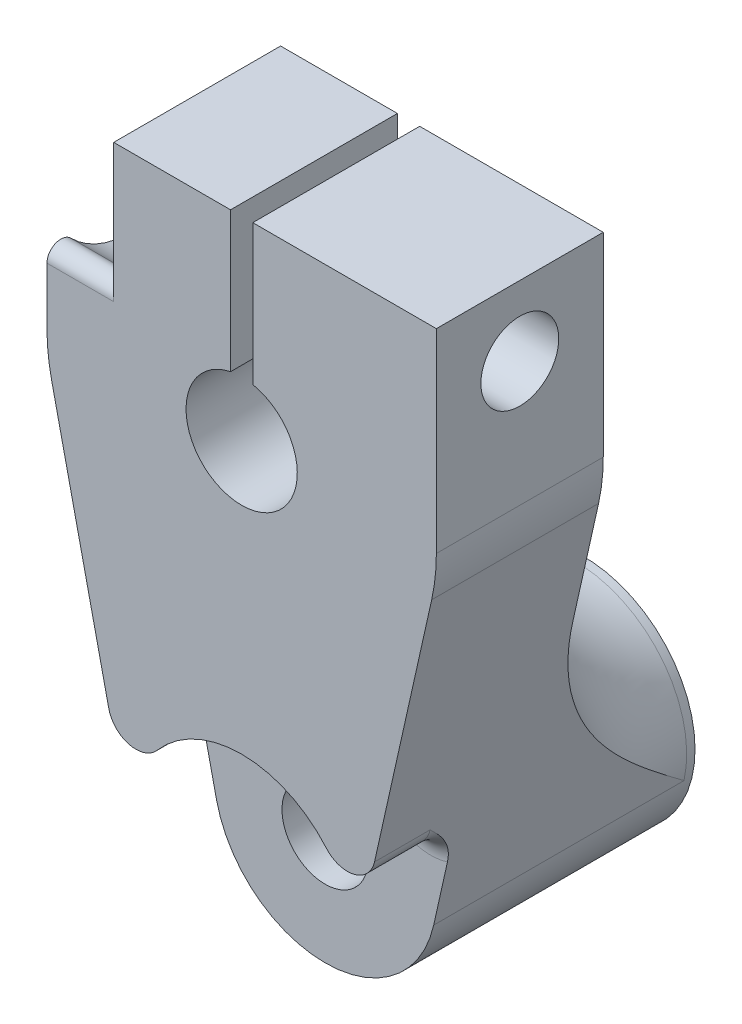
ISO-10303-21;
HEADER;
FILE_DESCRIPTION(('STEP AP214'),'2;1');
FILE_NAME('part.step','',(''),(''),'','','');
FILE_SCHEMA(('AUTOMOTIVE_DESIGN { 1 0 10303 214 1 1 1 1 }'));
ENDSEC;
DATA;
#1=APPLICATION_CONTEXT('core data for automotive mechanical design processes');
#2=APPLICATION_PROTOCOL_DEFINITION('international standard','automotive_design',2000,#1);
#3=PRODUCT_CONTEXT('',#1,'mechanical');
#4=PRODUCT('Part','Part','',(#3));
#5=PRODUCT_RELATED_PRODUCT_CATEGORY('part','',(#4));
#6=PRODUCT_DEFINITION_FORMATION('','',#4);
#7=PRODUCT_DEFINITION_CONTEXT('part definition',#1,'design');
#8=PRODUCT_DEFINITION('design','',#6,#7);
#9=PRODUCT_DEFINITION_SHAPE('','',#8);
#10=(LENGTH_UNIT() NAMED_UNIT(*) SI_UNIT(.MILLI.,.METRE.));
#11=(NAMED_UNIT(*) PLANE_ANGLE_UNIT() SI_UNIT($,.RADIAN.));
#12=(NAMED_UNIT(*) SI_UNIT($,.STERADIAN.) SOLID_ANGLE_UNIT());
#13=UNCERTAINTY_MEASURE_WITH_UNIT(LENGTH_MEASURE(1.E-05),#10,'distance_accuracy_value','');
#14=(GEOMETRIC_REPRESENTATION_CONTEXT(3) GLOBAL_UNCERTAINTY_ASSIGNED_CONTEXT((#13)) GLOBAL_UNIT_ASSIGNED_CONTEXT((#10,
#11,#12)) REPRESENTATION_CONTEXT('',''));
#15=CARTESIAN_POINT('',(0.,0.,0.));
#16=DIRECTION('',(0.,0.,1.));
#17=DIRECTION('',(1.,0.,0.));
#18=AXIS2_PLACEMENT_3D('',#15,#16,#17);
#19=CARTESIAN_POINT('',(0.,0.,6.3));
#20=DIRECTION('',(0.,0.,-1.));
#21=DIRECTION('',(-1.,0.,0.));
#22=AXIS2_PLACEMENT_3D('',#19,#20,#21);
#23=CYLINDRICAL_SURFACE('',#22,4.);
#24=CARTESIAN_POINT('',(0.,0.,0.));
#25=DIRECTION('',(0.,0.,1.));
#26=DIRECTION('',(1.,0.,0.));
#27=AXIS2_PLACEMENT_3D('',#24,#25,#26);
#28=CIRCLE('',#27,4.);
#29=CARTESIAN_POINT('',(4.,0.,0.));
#30=VERTEX_POINT('',#29);
#31=EDGE_CURVE('E270',#30,#30,#28,.T.);
#32=ORIENTED_EDGE('',*,*,#31,.T.);
#33=EDGE_LOOP('',(#32));
#34=FACE_BOUND('',#33,.T.);
#35=CARTESIAN_POINT('',(0.,0.,9.3));
#36=DIRECTION('',(0.,0.,1.));
#37=DIRECTION('',(1.,0.,0.));
#38=AXIS2_PLACEMENT_3D('',#35,#36,#37);
#39=CIRCLE('',#38,4.);
#40=CARTESIAN_POINT('',(-3.90359990726215,-0.872873280621486,9.3));
#41=VERTEX_POINT('',#40);
#42=CARTESIAN_POINT('',(3.90359990726215,-0.872873280621487,9.3));
#43=VERTEX_POINT('',#42);
#44=EDGE_CURVE('E536',#41,#43,#39,.T.);
#45=ORIENTED_EDGE('',*,*,#44,.F.);
#46=DIRECTION('',(0.,0.,-1.));
#47=VECTOR('',#46,1.);
#48=CARTESIAN_POINT('',(-3.90359990726215,-0.872873280621486,12.3));
#49=LINE('',#48,#47);
#50=CARTESIAN_POINT('',(-3.90359990726215,-0.872873280621486,0.3));
#51=VERTEX_POINT('',#50);
#52=EDGE_CURVE('E260',#41,#51,#49,.T.);
#53=ORIENTED_EDGE('',*,*,#52,.T.);
#54=CARTESIAN_POINT('',(0.,0.,0.3));
#55=DIRECTION('',(0.,0.,1.));
#56=DIRECTION('',(1.,0.,0.));
#57=AXIS2_PLACEMENT_3D('',#54,#55,#56);
#58=CIRCLE('',#57,4.);
#59=CARTESIAN_POINT('',(3.90359990726215,-0.872873280621487,0.3));
#60=VERTEX_POINT('',#59);
#61=EDGE_CURVE('E297',#51,#60,#58,.F.);
#62=ORIENTED_EDGE('',*,*,#61,.T.);
#63=DIRECTION('',(0.,0.,-1.));
#64=VECTOR('',#63,1.);
#65=CARTESIAN_POINT('',(3.90359990726215,-0.872873280621487,12.3));
#66=LINE('',#65,#64);
#67=EDGE_CURVE('E258',#43,#60,#66,.T.);
#68=ORIENTED_EDGE('',*,*,#67,.F.);
#69=EDGE_LOOP('',(#45,#53,#62,#68));
#70=FACE_BOUND('',#69,.T.);
#71=ADVANCED_FACE('F53',(#34,#70),#23,.T.);
#72=CARTESIAN_POINT('',(0.,0.,6.3));
#73=DIRECTION('',(0.,0.,-1.));
#74=DIRECTION('',(-1.,0.,0.));
#75=AXIS2_PLACEMENT_3D('',#72,#73,#74);
#76=CYLINDRICAL_SURFACE('',#75,1.55);
#77=CARTESIAN_POINT('',(0.,0.,0.));
#78=DIRECTION('',(0.,0.,1.));
#79=DIRECTION('',(1.,0.,0.));
#80=AXIS2_PLACEMENT_3D('',#77,#78,#79);
#81=CIRCLE('',#80,1.55);
#82=CARTESIAN_POINT('',(1.55,0.,0.));
#83=VERTEX_POINT('',#82);
#84=EDGE_CURVE('E267',#83,#83,#81,.T.);
#85=ORIENTED_EDGE('',*,*,#84,.F.);
#86=EDGE_LOOP('',(#85));
#87=FACE_BOUND('',#86,.T.);
#88=CARTESIAN_POINT('',(0.,0.,9.3));
#89=DIRECTION('',(0.,0.,1.));
#90=DIRECTION('',(1.,0.,0.));
#91=AXIS2_PLACEMENT_3D('',#88,#89,#90);
#92=CIRCLE('',#91,1.55);
#93=CARTESIAN_POINT('',(1.55,0.,9.3));
#94=VERTEX_POINT('',#93);
#95=EDGE_CURVE('E539',#94,#94,#92,.T.);
#96=ORIENTED_EDGE('',*,*,#95,.T.);
#97=EDGE_LOOP('',(#96));
#98=FACE_BOUND('',#97,.T.);
#99=ADVANCED_FACE('F415',(#87,#98),#76,.F.);
#100=CARTESIAN_POINT('',(0.,20.7477,12.3));
#101=DIRECTION('',(0.,1.,0.));
#102=DIRECTION('',(0.,0.,1.));
#103=AXIS2_PLACEMENT_3D('',#100,#101,#102);
#104=PLANE('',#103);
#105=DIRECTION('',(1.,0.,0.));
#106=VECTOR('',#105,1.);
#107=CARTESIAN_POINT('',(0.,20.7477,6.3));
#108=LINE('',#107,#106);
#109=CARTESIAN_POINT('',(-4.6,20.7477,6.3));
#110=VERTEX_POINT('',#109);
#111=CARTESIAN_POINT('',(-0.4,20.7477,6.3));
#112=VERTEX_POINT('',#111);
#113=EDGE_CURVE('E228',#110,#112,#108,.T.);
#114=ORIENTED_EDGE('',*,*,#113,.F.);
#115=DIRECTION('',(0.,0.,1.));
#116=VECTOR('',#115,1.);
#117=CARTESIAN_POINT('',(-4.6,20.7477,12.3));
#118=LINE('',#117,#116);
#119=CARTESIAN_POINT('',(-4.6,20.7477,12.3));
#120=VERTEX_POINT('',#119);
#121=EDGE_CURVE('E210',#110,#120,#118,.T.);
#122=ORIENTED_EDGE('',*,*,#121,.T.);
#123=DIRECTION('',(1.,0.,0.));
#124=VECTOR('',#123,1.);
#125=CARTESIAN_POINT('',(0.,20.7477,12.3));
#126=LINE('',#125,#124);
#127=CARTESIAN_POINT('',(-0.399999999999999,20.7477,12.3));
#128=VERTEX_POINT('',#127);
#129=EDGE_CURVE('E254',#120,#128,#126,.T.);
#130=ORIENTED_EDGE('',*,*,#129,.T.);
#131=DIRECTION('',(0.,0.,1.));
#132=VECTOR('',#131,1.);
#133=CARTESIAN_POINT('',(-0.4,20.7477,12.3));
#134=LINE('',#133,#132);
#135=EDGE_CURVE('E239',#112,#128,#134,.T.);
#136=ORIENTED_EDGE('',*,*,#135,.F.);
#137=EDGE_LOOP('',(#114,#122,#130,#136));
#138=FACE_BOUND('',#137,.T.);
#139=ADVANCED_FACE('F237',(#138),#104,.T.);
#140=CARTESIAN_POINT('',(0.,0.,6.3));
#141=DIRECTION('',(0.,0.,1.));
#142=DIRECTION('',(1.,0.,0.));
#143=AXIS2_PLACEMENT_3D('',#140,#141,#142);
#144=PLANE('',#143);
#145=DIRECTION('',(-0.218218320155372,-0.975899976815538,0.));
#146=VECTOR('',#145,1.);
#147=CARTESIAN_POINT('',(3.90359990726215,-0.872873280621486,6.3));
#148=LINE('',#147,#146);
#149=CARTESIAN_POINT('',(6.83129983770877,12.2201717589124,6.3));
#150=VERTEX_POINT('',#149);
#151=CARTESIAN_POINT('',(5.90360384753835,8.07139774830422,6.3));
#152=VERTEX_POINT('',#151);
#153=EDGE_CURVE('E487',#150,#152,#148,.T.);
#154=ORIENTED_EDGE('',*,*,#153,.T.);
#155=CARTESIAN_POINT('',(0.,0.,6.3));
#156=DIRECTION('',(0.,0.,1.));
#157=DIRECTION('',(1.,0.,0.));
#158=AXIS2_PLACEMENT_3D('',#155,#156,#157);
#159=CIRCLE('',#158,10.);
#160=CARTESIAN_POINT('',(-5.90360384753835,8.07139774830422,6.3));
#161=VERTEX_POINT('',#160);
#162=EDGE_CURVE('E294',#152,#161,#159,.T.);
#163=ORIENTED_EDGE('',*,*,#162,.T.);
#164=DIRECTION('',(0.218218320155372,-0.975899976815538,0.));
#165=VECTOR('',#164,1.);
#166=CARTESIAN_POINT('',(-3.90359990726215,-0.872873280621486,6.3));
#167=LINE('',#166,#165);
#168=CARTESIAN_POINT('',(-6.83129983770877,12.2201717589124,6.3));
#169=VERTEX_POINT('',#168);
#170=EDGE_CURVE('E484',#169,#161,#167,.T.);
#171=ORIENTED_EDGE('',*,*,#170,.F.);
#172=CARTESIAN_POINT('',(0.,13.7477,6.3));
#173=DIRECTION('',(0.,0.,1.));
#174=DIRECTION('',(1.,0.,0.));
#175=AXIS2_PLACEMENT_3D('',#172,#173,#174);
#176=CIRCLE('',#175,7.);
#177=CARTESIAN_POINT('',(-7.,13.7477,6.3));
#178=VERTEX_POINT('',#177);
#179=EDGE_CURVE('E481',#178,#169,#176,.T.);
#180=ORIENTED_EDGE('',*,*,#179,.F.);
#181=DIRECTION('',(0.,1.,0.));
#182=VECTOR('',#181,1.);
#183=CARTESIAN_POINT('',(-7.,0.,6.3));
#184=LINE('',#183,#182);
#185=CARTESIAN_POINT('',(-7.,15.7867723410793,6.3));
#186=VERTEX_POINT('',#185);
#187=EDGE_CURVE('E479',#178,#186,#184,.T.);
#188=ORIENTED_EDGE('',*,*,#187,.T.);
#189=DIRECTION('',(-1.,0.,0.));
#190=VECTOR('',#189,1.);
#191=CARTESIAN_POINT('',(-4.6,15.7867723410793,6.3));
#192=LINE('',#191,#190);
#193=CARTESIAN_POINT('',(-4.6,15.7867723410793,6.3));
#194=VERTEX_POINT('',#193);
#195=EDGE_CURVE('E232',#186,#194,#192,.F.);
#196=ORIENTED_EDGE('',*,*,#195,.T.);
#197=DIRECTION('',(0.,1.,0.));
#198=VECTOR('',#197,1.);
#199=CARTESIAN_POINT('',(-4.6,0.,6.3));
#200=LINE('',#199,#198);
#201=EDGE_CURVE('E213',#194,#110,#200,.T.);
#202=ORIENTED_EDGE('',*,*,#201,.T.);
#203=ORIENTED_EDGE('',*,*,#113,.T.);
#204=DIRECTION('',(0.,-1.,0.));
#205=VECTOR('',#204,1.);
#206=CARTESIAN_POINT('',(-0.399999999999997,0.,6.3));
#207=LINE('',#206,#205);
#208=CARTESIAN_POINT('',(-0.399999999999999,15.7072917942265,6.3));
#209=VERTEX_POINT('',#208);
#210=EDGE_CURVE('E456',#112,#209,#207,.T.);
#211=ORIENTED_EDGE('',*,*,#210,.T.);
#212=CARTESIAN_POINT('',(0.,13.7477,6.3));
#213=DIRECTION('',(0.,0.,1.));
#214=DIRECTION('',(1.,0.,0.));
#215=AXIS2_PLACEMENT_3D('',#212,#213,#214);
#216=CIRCLE('',#215,2.);
#217=CARTESIAN_POINT('',(0.400000000000001,15.7072917942265,6.3));
#218=VERTEX_POINT('',#217);
#219=EDGE_CURVE('E458',#209,#218,#216,.T.);
#220=ORIENTED_EDGE('',*,*,#219,.T.);
#221=DIRECTION('',(0.,1.,0.));
#222=VECTOR('',#221,1.);
#223=CARTESIAN_POINT('',(0.400000000000003,0.,6.3));
#224=LINE('',#223,#222);
#225=CARTESIAN_POINT('',(0.4,20.7477,6.3));
#226=VERTEX_POINT('',#225);
#227=EDGE_CURVE('E449',#218,#226,#224,.T.);
#228=ORIENTED_EDGE('',*,*,#227,.T.);
#229=CARTESIAN_POINT('',(7.,20.7477,6.3));
#230=VERTEX_POINT('',#229);
#231=EDGE_CURVE('E241',#226,#230,#108,.T.);
#232=ORIENTED_EDGE('',*,*,#231,.T.);
#233=DIRECTION('',(0.,-1.,0.));
#234=VECTOR('',#233,1.);
#235=CARTESIAN_POINT('',(7.,0.,6.3));
#236=LINE('',#235,#234);
#237=CARTESIAN_POINT('',(7.,13.7477,6.3));
#238=VERTEX_POINT('',#237);
#239=EDGE_CURVE('E246',#230,#238,#236,.T.);
#240=ORIENTED_EDGE('',*,*,#239,.T.);
#241=CARTESIAN_POINT('',(0.,13.7477,6.3));
#242=DIRECTION('',(0.,0.,1.));
#243=DIRECTION('',(1.,0.,0.));
#244=AXIS2_PLACEMENT_3D('',#241,#242,#243);
#245=CIRCLE('',#244,7.);
#246=EDGE_CURVE('E488',#150,#238,#245,.T.);
#247=ORIENTED_EDGE('',*,*,#246,.F.);
#248=EDGE_LOOP('',(#154,#163,#171,#180,#188,#196,#202,#203,#211,#220,#228,#232,#240,#247));
#249=FACE_BOUND('',#248,.T.);
#250=ADVANCED_FACE('F226',(#249),#144,.F.);
#251=CARTESIAN_POINT('',(-7.,0.,12.3));
#252=DIRECTION('',(-1.,0.,0.));
#253=DIRECTION('',(0.,0.,1.));
#254=AXIS2_PLACEMENT_3D('',#251,#252,#253);
#255=PLANE('',#254);
#256=DIRECTION('',(0.,1.,0.));
#257=VECTOR('',#256,1.);
#258=CARTESIAN_POINT('',(-7.,0.,12.3));
#259=LINE('',#258,#257);
#260=CARTESIAN_POINT('',(-7.,13.7477,12.3));
#261=VERTEX_POINT('',#260);
#262=CARTESIAN_POINT('',(-7.,15.7867723410793,12.3));
#263=VERTEX_POINT('',#262);
#264=EDGE_CURVE('E244',#261,#263,#259,.T.);
#265=ORIENTED_EDGE('',*,*,#264,.T.);
#266=CARTESIAN_POINT('',(-7.,15.7867723410793,11.8));
#267=DIRECTION('',(-1.,0.,0.));
#268=DIRECTION('',(0.,0.,1.));
#269=AXIS2_PLACEMENT_3D('',#266,#267,#268);
#270=CIRCLE('',#269,0.5);
#271=CARTESIAN_POINT('',(-7.,16.1366994471912,11.4428571428571));
#272=VERTEX_POINT('',#271);
#273=EDGE_CURVE('E287',#263,#272,#270,.T.);
#274=ORIENTED_EDGE('',*,*,#273,.T.);
#275=CARTESIAN_POINT('',(-7.,18.2362620838625,9.3));
#276=DIRECTION('',(-1.,0.,0.));
#277=DIRECTION('',(0.,-1.,0.));
#278=AXIS2_PLACEMENT_3D('',#275,#276,#277);
#279=CIRCLE('',#278,3.);
#280=CARTESIAN_POINT('',(-7.,16.1366994471912,7.15714285714286));
#281=VERTEX_POINT('',#280);
#282=EDGE_CURVE('E221',#281,#272,#279,.T.);
#283=ORIENTED_EDGE('',*,*,#282,.F.);
#284=CARTESIAN_POINT('',(-7.,15.7867723410793,6.8));
#285=DIRECTION('',(-1.,0.,0.));
#286=DIRECTION('',(0.,0.,1.));
#287=AXIS2_PLACEMENT_3D('',#284,#285,#286);
#288=CIRCLE('',#287,0.5);
#289=EDGE_CURVE('E285',#281,#186,#288,.T.);
#290=ORIENTED_EDGE('',*,*,#289,.T.);
#291=ORIENTED_EDGE('',*,*,#187,.F.);
#292=DIRECTION('',(0.,0.,-1.));
#293=VECTOR('',#292,1.);
#294=CARTESIAN_POINT('',(-7.,13.7477,12.3));
#295=LINE('',#294,#293);
#296=EDGE_CURVE('E265',#261,#178,#295,.T.);
#297=ORIENTED_EDGE('',*,*,#296,.F.);
#298=EDGE_LOOP('',(#265,#274,#283,#290,#291,#297));
#299=FACE_BOUND('',#298,.T.);
#300=ADVANCED_FACE('F375',(#299),#255,.T.);
#301=CARTESIAN_POINT('',(0.,0.,12.3));
#302=DIRECTION('',(0.,0.,1.));
#303=DIRECTION('',(1.,0.,0.));
#304=AXIS2_PLACEMENT_3D('',#301,#302,#303);
#305=PLANE('',#304);
#306=DIRECTION('',(0.218218320155372,-0.975899976815538,0.));
#307=VECTOR('',#306,1.);
#308=CARTESIAN_POINT('',(-3.90359990726215,-0.872873280621486,12.3));
#309=LINE('',#308,#307);
#310=CARTESIAN_POINT('',(-6.83129983770877,12.2201717589124,12.3));
#311=VERTEX_POINT('',#310);
#312=CARTESIAN_POINT('',(-4.77647318788364,3.03072662664066,12.3));
#313=VERTEX_POINT('',#312);
#314=EDGE_CURVE('E464',#311,#313,#309,.T.);
#315=ORIENTED_EDGE('',*,*,#314,.T.);
#316=CARTESIAN_POINT('',(-3.8005732110681,3.24894494679603,12.3));
#317=DIRECTION('',(0.,0.,1.));
#318=DIRECTION('',(1.,0.,0.));
#319=AXIS2_PLACEMENT_3D('',#316,#317,#318);
#320=CIRCLE('',#319,1.);
#321=CARTESIAN_POINT('',(-3.04045856885448,2.59915595743683,12.3));
#322=VERTEX_POINT('',#321);
#323=EDGE_CURVE('E516',#313,#322,#320,.T.);
#324=ORIENTED_EDGE('',*,*,#323,.T.);
#325=CARTESIAN_POINT('',(0.,0.,12.3));
#326=DIRECTION('',(0.,0.,1.));
#327=DIRECTION('',(1.,0.,0.));
#328=AXIS2_PLACEMENT_3D('',#325,#326,#327);
#329=CIRCLE('',#328,4.);
#330=CARTESIAN_POINT('',(3.04045856885448,2.59915595743683,12.3));
#331=VERTEX_POINT('',#330);
#332=EDGE_CURVE('E535',#331,#322,#329,.T.);
#333=ORIENTED_EDGE('',*,*,#332,.F.);
#334=CARTESIAN_POINT('',(3.8005732110681,3.24894494679604,12.3));
#335=DIRECTION('',(0.,0.,1.));
#336=DIRECTION('',(1.,0.,0.));
#337=AXIS2_PLACEMENT_3D('',#334,#335,#336);
#338=CIRCLE('',#337,1.);
#339=CARTESIAN_POINT('',(4.77647318788364,3.03072662664067,12.3));
#340=VERTEX_POINT('',#339);
#341=EDGE_CURVE('E503',#331,#340,#338,.T.);
#342=ORIENTED_EDGE('',*,*,#341,.T.);
#343=DIRECTION('',(-0.218218320155372,-0.975899976815538,0.));
#344=VECTOR('',#343,1.);
#345=CARTESIAN_POINT('',(3.90359990726215,-0.872873280621486,12.3));
#346=LINE('',#345,#344);
#347=CARTESIAN_POINT('',(6.83129983770877,12.2201717589124,12.3));
#348=VERTEX_POINT('',#347);
#349=EDGE_CURVE('E467',#348,#340,#346,.T.);
#350=ORIENTED_EDGE('',*,*,#349,.F.);
#351=CARTESIAN_POINT('',(0.,13.7477,12.3));
#352=DIRECTION('',(0.,0.,1.));
#353=DIRECTION('',(1.,0.,0.));
#354=AXIS2_PLACEMENT_3D('',#351,#352,#353);
#355=CIRCLE('',#354,7.);
#356=CARTESIAN_POINT('',(7.,13.7477,12.3));
#357=VERTEX_POINT('',#356);
#358=EDGE_CURVE('E470',#348,#357,#355,.T.);
#359=ORIENTED_EDGE('',*,*,#358,.T.);
#360=DIRECTION('',(0.,-1.,0.));
#361=VECTOR('',#360,1.);
#362=CARTESIAN_POINT('',(7.,0.,12.3));
#363=LINE('',#362,#361);
#364=CARTESIAN_POINT('',(7.,20.7477,12.3));
#365=VERTEX_POINT('',#364);
#366=EDGE_CURVE('E472',#365,#357,#363,.T.);
#367=ORIENTED_EDGE('',*,*,#366,.F.);
#368=CARTESIAN_POINT('',(0.4,20.7477,12.3));
#369=VERTEX_POINT('',#368);
#370=EDGE_CURVE('E475',#369,#365,#126,.T.);
#371=ORIENTED_EDGE('',*,*,#370,.F.);
#372=DIRECTION('',(0.,1.,0.));
#373=VECTOR('',#372,1.);
#374=CARTESIAN_POINT('',(0.400000000000003,0.,12.3));
#375=LINE('',#374,#373);
#376=CARTESIAN_POINT('',(0.400000000000001,15.7072917942265,12.3));
#377=VERTEX_POINT('',#376);
#378=EDGE_CURVE('E273',#377,#369,#375,.T.);
#379=ORIENTED_EDGE('',*,*,#378,.F.);
#380=CARTESIAN_POINT('',(0.,13.7477,12.3));
#381=DIRECTION('',(0.,0.,1.));
#382=DIRECTION('',(1.,0.,0.));
#383=AXIS2_PLACEMENT_3D('',#380,#381,#382);
#384=CIRCLE('',#383,2.);
#385=CARTESIAN_POINT('',(-0.399999999999999,15.7072917942265,12.3));
#386=VERTEX_POINT('',#385);
#387=EDGE_CURVE('E240',#386,#377,#384,.T.);
#388=ORIENTED_EDGE('',*,*,#387,.F.);
#389=DIRECTION('',(0.,-1.,0.));
#390=VECTOR('',#389,1.);
#391=CARTESIAN_POINT('',(-0.399999999999997,0.,12.3));
#392=LINE('',#391,#390);
#393=EDGE_CURVE('E275',#128,#386,#392,.T.);
#394=ORIENTED_EDGE('',*,*,#393,.F.);
#395=ORIENTED_EDGE('',*,*,#129,.F.);
#396=DIRECTION('',(0.,-1.,0.));
#397=VECTOR('',#396,1.);
#398=CARTESIAN_POINT('',(-4.6,0.,12.3));
#399=LINE('',#398,#397);
#400=CARTESIAN_POINT('',(-4.6,15.7867723410793,12.3));
#401=VERTEX_POINT('',#400);
#402=EDGE_CURVE('E216',#120,#401,#399,.T.);
#403=ORIENTED_EDGE('',*,*,#402,.T.);
#404=DIRECTION('',(1.,0.,0.));
#405=VECTOR('',#404,1.);
#406=CARTESIAN_POINT('',(0.,15.7867723410793,12.3));
#407=LINE('',#406,#405);
#408=EDGE_CURVE('E283',#401,#263,#407,.F.);
#409=ORIENTED_EDGE('',*,*,#408,.T.);
#410=ORIENTED_EDGE('',*,*,#264,.F.);
#411=CARTESIAN_POINT('',(0.,13.7477,12.3));
#412=DIRECTION('',(0.,0.,1.));
#413=DIRECTION('',(1.,0.,0.));
#414=AXIS2_PLACEMENT_3D('',#411,#412,#413);
#415=CIRCLE('',#414,7.);
#416=EDGE_CURVE('E461',#261,#311,#415,.T.);
#417=ORIENTED_EDGE('',*,*,#416,.T.);
#418=EDGE_LOOP('',(#315,#324,#333,#342,#350,#359,#367,#371,#379,#388,#394,#395,#403,#409,#410,#417));
#419=FACE_BOUND('',#418,.T.);
#420=ADVANCED_FACE('F376',(#419),#305,.T.);
#421=CARTESIAN_POINT('',(0.,0.,0.));
#422=DIRECTION('',(0.,0.,1.));
#423=DIRECTION('',(1.,0.,0.));
#424=AXIS2_PLACEMENT_3D('',#421,#422,#423);
#425=PLANE('',#424);
#426=ORIENTED_EDGE('',*,*,#31,.F.);
#427=EDGE_LOOP('',(#426));
#428=FACE_BOUND('',#427,.T.);
#429=ORIENTED_EDGE('',*,*,#84,.T.);
#430=EDGE_LOOP('',(#429));
#431=FACE_BOUND('',#430,.T.);
#432=ADVANCED_FACE('F379',(#428,#431),#425,.F.);
#433=CARTESIAN_POINT('',(0.,13.7477,12.3));
#434=DIRECTION('',(0.,0.,-1.));
#435=DIRECTION('',(-1.,0.,0.));
#436=AXIS2_PLACEMENT_3D('',#433,#434,#435);
#437=CYLINDRICAL_SURFACE('',#436,7.);
#438=ORIENTED_EDGE('',*,*,#179,.T.);
#439=DIRECTION('',(0.,0.,-1.));
#440=VECTOR('',#439,1.);
#441=CARTESIAN_POINT('',(-6.83129983770877,12.2201717589124,12.3));
#442=LINE('',#441,#440);
#443=EDGE_CURVE('E262',#311,#169,#442,.T.);
#444=ORIENTED_EDGE('',*,*,#443,.F.);
#445=ORIENTED_EDGE('',*,*,#416,.F.);
#446=ORIENTED_EDGE('',*,*,#296,.T.);
#447=EDGE_LOOP('',(#438,#444,#445,#446));
#448=FACE_BOUND('',#447,.T.);
#449=ADVANCED_FACE('F573',(#448),#437,.T.);
#450=CARTESIAN_POINT('',(-3.90359990726215,-0.872873280621486,12.3));
#451=DIRECTION('',(0.975899976815538,0.218218320155372,0.));
#452=DIRECTION('',(-0.218218320155372,0.975899976815538,0.));
#453=AXIS2_PLACEMENT_3D('',#450,#451,#452);
#454=PLANE('',#453);
#455=ORIENTED_EDGE('',*,*,#52,.F.);
#456=DIRECTION('',(-0.218218320155372,0.975899976815538,0.));
#457=VECTOR('',#456,1.);
#458=CARTESIAN_POINT('',(-3.90359990726215,-0.872873280621486,9.3));
#459=LINE('',#458,#457);
#460=CARTESIAN_POINT('',(-4.3985079702322,1.34041828369086,9.3));
#461=VERTEX_POINT('',#460);
#462=EDGE_CURVE('E587',#41,#461,#459,.T.);
#463=ORIENTED_EDGE('',*,*,#462,.T.);
#464=CARTESIAN_POINT('',(-4.3985079702322,1.34041828369086,9.3));
#465=CARTESIAN_POINT('',(-4.40785983175291,1.38224099332746,9.29999719638696));
#466=CARTESIAN_POINT('',(-4.41720364710504,1.42402771947868,9.30206602766505));
#467=CARTESIAN_POINT('',(-4.43579849064162,1.50718621581076,9.31007196565));
#468=CARTESIAN_POINT('',(-4.44504963831165,1.54855852034627,9.31600318556926));
#469=CARTESIAN_POINT('',(-4.47236125757803,1.67069954219029,9.33899489781268));
#470=CARTESIAN_POINT('',(-4.49021776531515,1.75055610727728,9.36126812700592));
#471=CARTESIAN_POINT('',(-4.53149220480163,1.93514063028731,9.42790134045869));
#472=CARTESIAN_POINT('',(-4.55450653430521,2.03806362782928,9.47739633549625));
#473=CARTESIAN_POINT('',(-4.59864502311344,2.23545654229199,9.592304843443));
#474=CARTESIAN_POINT('',(-4.61975789889868,2.32987599788425,9.65780578217856));
#475=CARTESIAN_POINT('',(-4.66437034433781,2.52938850645242,9.81342065488173));
#476=CARTESIAN_POINT('',(-4.68747703724142,2.63272456482212,9.90582936815491));
#477=CARTESIAN_POINT('',(-4.73222454183846,2.83284107505701,10.0973240320008));
#478=CARTESIAN_POINT('',(-4.75386648528897,2.92962658828321,10.1964047065238));
#479=CARTESIAN_POINT('',(-4.77582258664028,3.02781705544675,10.2970185776463));
#480=CARTESIAN_POINT('',(-4.77614788731159,3.02927184126566,10.298509289678));
#481=CARTESIAN_POINT('',(-4.77647318788364,3.03072662664066,10.3));
#482=B_SPLINE_CURVE_WITH_KNOTS('',3,(#464,#465,#466,#467,#468,#469,#470,#471,#472,#473,#474,
#475,#476,#477,#478,#479,#480,#481),.UNSPECIFIED.,.F.,.F.,(4,2,2,2,2,2,2,2,4),(0.,
0.128456249212672,0.256717171022871,0.510014180776442,0.857583473002465,1.20709540467852,
1.62797108908901,2.04851777580517,2.05484233112552),.UNSPECIFIED.);
#483=CARTESIAN_POINT('',(-4.77647318788364,3.03072662664066,10.3));
#484=VERTEX_POINT('',#483);
#485=EDGE_CURVE('E12',#461,#484,#482,.T.);
#486=ORIENTED_EDGE('',*,*,#485,.T.);
#487=DIRECTION('',(0.,0.,1.));
#488=VECTOR('',#487,1.);
#489=CARTESIAN_POINT('',(-4.77647318788364,3.03072662664066,12.3));
#490=LINE('',#489,#488);
#491=EDGE_CURVE('E586',#484,#313,#490,.T.);
#492=ORIENTED_EDGE('',*,*,#491,.T.);
#493=ORIENTED_EDGE('',*,*,#314,.F.);
#494=ORIENTED_EDGE('',*,*,#443,.T.);
#495=ORIENTED_EDGE('',*,*,#170,.T.);
#496=CARTESIAN_POINT('',(-5.90360384753835,8.07139774830422,6.3));
#497=CARTESIAN_POINT('',(-5.85704005800829,7.86315858171877,6.30003175532883));
#498=CARTESIAN_POINT('',(-5.81049188795251,7.65498926740136,6.29044153339773));
#499=CARTESIAN_POINT('',(-5.71779330573279,7.24042946245626,6.2529192043677));
#500=CARTESIAN_POINT('',(-5.67164254350833,7.0340374063136,6.22500537952476));
#501=CARTESIAN_POINT('',(-5.58037983255979,6.62589899962347,6.1520291750219));
#502=CARTESIAN_POINT('',(-5.53526251354273,6.42412863244544,6.10710656266764));
#503=CARTESIAN_POINT('',(-5.44592964273126,6.02462071536629,6.00113302377586));
#504=CARTESIAN_POINT('',(-5.4017143955421,5.82688452769851,5.94007674334723));
#505=CARTESIAN_POINT('',(-5.30241276816937,5.38279506819851,5.78413338317198));
#506=CARTESIAN_POINT('',(-5.24767550834297,5.13800310683848,5.68456031841384));
#507=CARTESIAN_POINT('',(-5.14034631185672,4.6580133411397,5.46358573795091));
#508=CARTESIAN_POINT('',(-5.0877548375729,4.42281760460514,5.34217954778158));
#509=CARTESIAN_POINT('',(-4.98479198130057,3.9623546655747,5.07987751323458));
#510=CARTESIAN_POINT('',(-4.93442601026533,3.73711166154741,4.93893728093853));
#511=CARTESIAN_POINT('',(-4.83609214003036,3.29735013458595,4.64040199362296));
#512=CARTESIAN_POINT('',(-4.78812519672527,3.08283588653374,4.48280037652402));
#513=CARTESIAN_POINT('',(-4.66132891695546,2.51578685783829,4.03661177184437));
#514=CARTESIAN_POINT('',(-4.58476867111281,2.17339973795929,3.73447526986431));
#515=CARTESIAN_POINT('',(-4.43761313707231,1.51530154457132,3.10108229203332));
#516=CARTESIAN_POINT('',(-4.36702389916179,1.19961752871393,2.76979695747292));
#517=CARTESIAN_POINT('',(-4.16169722763538,0.281370637987368,1.74776551354131));
#518=CARTESIAN_POINT('',(-4.03360608070923,-0.29146920069586,1.02965196773987));
#519=CARTESIAN_POINT('',(-3.9050252979977,-0.866498752649739,0.307999979529847));
#520=CARTESIAN_POINT('',(-3.90431259991216,-0.869686028789806,0.303999979398724));
#521=CARTESIAN_POINT('',(-3.90359990726215,-0.872873280621486,0.3));
#522=B_SPLINE_CURVE_WITH_KNOTS('',3,(#496,#497,#498,#499,#500,#501,#502,#503,#504,#505,#506,
#507,#508,#509,#510,#511,#512,#513,#514,#515,#516,#517,#518,#519,#520,#521),.UNSPECIFIED.,.F.,
.F.,(4,2,2,2,2,2,2,2,2,2,2,2,4),(0.,0.639823788263608,1.2790101648161,1.91305426725046,
2.54730903941338,3.35574320859075,4.16435066975329,4.97482664009588,5.78562301371456,
7.1721120982094,8.55998965910043,11.3394337467024,11.3549256800873),.UNSPECIFIED.);
#523=EDGE_CURVE('E300',#161,#51,#522,.T.);
#524=ORIENTED_EDGE('',*,*,#523,.T.);
#525=EDGE_LOOP('',(#455,#463,#486,#492,#493,#494,#495,#524));
#526=FACE_BOUND('',#525,.T.);
#527=ADVANCED_FACE('F316',(#526),#454,.F.);
#528=CARTESIAN_POINT('',(3.90359990726215,-0.872873280621486,12.3));
#529=DIRECTION('',(0.975899976815538,-0.218218320155372,0.));
#530=DIRECTION('',(0.218218320155372,0.975899976815538,0.));
#531=AXIS2_PLACEMENT_3D('',#528,#529,#530);
#532=PLANE('',#531);
#533=ORIENTED_EDGE('',*,*,#349,.T.);
#534=DIRECTION('',(0.,0.,-1.));
#535=VECTOR('',#534,1.);
#536=CARTESIAN_POINT('',(4.77647318788364,3.03072662664066,9.3));
#537=LINE('',#536,#535);
#538=CARTESIAN_POINT('',(4.77647318788364,3.03072662664066,10.3));
#539=VERTEX_POINT('',#538);
#540=EDGE_CURVE('E506',#340,#539,#537,.T.);
#541=ORIENTED_EDGE('',*,*,#540,.T.);
#542=CARTESIAN_POINT('',(4.3985079702322,1.34041828369086,9.3));
#543=CARTESIAN_POINT('',(4.40785983175292,1.3822409933275,9.29999719638696));
#544=CARTESIAN_POINT('',(4.41720364710506,1.42402771947877,9.30206602766505));
#545=CARTESIAN_POINT('',(4.43579849064166,1.50718621581093,9.31007196565002));
#546=CARTESIAN_POINT('',(4.44504963831169,1.54855852034648,9.31600318556929));
#547=CARTESIAN_POINT('',(4.47236125757807,1.67069954219045,9.33899489781272));
#548=CARTESIAN_POINT('',(4.49021776531517,1.75055610727737,9.36126812700595));
#549=CARTESIAN_POINT('',(4.53149220480162,1.93514063028725,9.42790134045868));
#550=CARTESIAN_POINT('',(4.55450653430517,2.03806362782913,9.47739633549623));
#551=CARTESIAN_POINT('',(4.59864502311342,2.23545654229192,9.59230484344289));
#552=CARTESIAN_POINT('',(4.6197578988987,2.32987599788433,9.65780578217839));
#553=CARTESIAN_POINT('',(4.66437034433778,2.5293885064523,9.81342065488191));
#554=CARTESIAN_POINT('',(4.68747703724129,2.63272456482157,9.90582936815558));
#555=CARTESIAN_POINT('',(4.73222454183862,2.83284107505767,10.0973240320002));
#556=CARTESIAN_POINT('',(4.75386648528951,2.92962658828554,10.1964047065214));
#557=CARTESIAN_POINT('',(4.77582258664029,3.02781705544682,10.2970185776462));
#558=CARTESIAN_POINT('',(4.7761478873116,3.02927184126569,10.298509289678));
#559=CARTESIAN_POINT('',(4.77647318788364,3.03072662664067,10.3));
#560=B_SPLINE_CURVE_WITH_KNOTS('',3,(#542,#543,#544,#545,#546,#547,#548,#549,#550,#551,#552,
#553,#554,#555,#556,#557,#558,#559),.UNSPECIFIED.,.F.,.F.,(4,2,2,2,2,2,2,2,4),(0.,
0.128456249212795,0.256717171023121,0.510014180776443,0.857583473002268,1.20709540467852,
1.62797108908912,2.04851777580517,2.05484233112552),.UNSPECIFIED.);
#561=CARTESIAN_POINT('',(4.3985079702322,1.34041828369086,9.3));
#562=VERTEX_POINT('',#561);
#563=EDGE_CURVE('E63',#539,#562,#560,.F.);
#564=ORIENTED_EDGE('',*,*,#563,.T.);
#565=DIRECTION('',(-0.218218320155372,-0.975899976815538,0.));
#566=VECTOR('',#565,1.);
#567=CARTESIAN_POINT('',(3.90359990726215,-0.872873280621486,9.3));
#568=LINE('',#567,#566);
#569=EDGE_CURVE('E512',#562,#43,#568,.T.);
#570=ORIENTED_EDGE('',*,*,#569,.T.);
#571=ORIENTED_EDGE('',*,*,#67,.T.);
#572=CARTESIAN_POINT('',(5.90360384753835,8.07139774830422,6.3));
#573=CARTESIAN_POINT('',(5.85704005800845,7.8631585817195,6.30003175532883));
#574=CARTESIAN_POINT('',(5.81049188795283,7.65498926740282,6.29044153339779));
#575=CARTESIAN_POINT('',(5.71779330573344,7.24042946245918,6.25291920436803));
#576=CARTESIAN_POINT('',(5.67164254350915,7.03403740631725,6.22500537952528));
#577=CARTESIAN_POINT('',(5.5803798325606,6.62589899962711,6.15202917502268));
#578=CARTESIAN_POINT('',(5.53526251354338,6.42412863244835,6.10710656266835));
#579=CARTESIAN_POINT('',(5.44592964273158,6.02462071536774,6.00113302377631));
#580=CARTESIAN_POINT('',(5.40171439554226,5.82688452769923,5.94007674334748));
#581=CARTESIAN_POINT('',(5.30241276816923,5.38279506819789,5.78413338317176));
#582=CARTESIAN_POINT('',(5.2476755083427,5.13800310683725,5.68456031841333));
#583=CARTESIAN_POINT('',(5.1403463118562,4.65801334113737,5.46358573794977));
#584=CARTESIAN_POINT('',(5.08775483757227,4.42281760460232,5.34217954778011));
#585=CARTESIAN_POINT('',(4.98479198129997,3.96235466557202,5.07987751323292));
#586=CARTESIAN_POINT('',(4.93442601026486,3.73711166154531,4.9389372809371));
#587=CARTESIAN_POINT('',(4.83609214003011,3.29735013458486,4.64040199362223));
#588=CARTESIAN_POINT('',(4.78812519672512,3.08283588653306,4.48280037652376));
#589=CARTESIAN_POINT('',(4.66132891695557,2.51578685783879,4.03661177184431));
#590=CARTESIAN_POINT('',(4.58476867111322,2.17339973796111,3.7344752698635));
#591=CARTESIAN_POINT('',(4.43761313707229,1.51530154457126,3.10108229203583));
#592=CARTESIAN_POINT('',(4.36702389916105,1.19961752871061,2.76979695747956));
#593=CARTESIAN_POINT('',(4.16169722763813,0.281370637999756,1.74776551353438));
#594=CARTESIAN_POINT('',(4.03360608072248,-0.291469200636242,1.02965196769157));
#595=CARTESIAN_POINT('',(3.90502529799783,-0.866498752649171,0.30799997952919));
#596=CARTESIAN_POINT('',(3.90431259991222,-0.86968602878952,0.303999979398394));
#597=CARTESIAN_POINT('',(3.90359990726215,-0.872873280621486,0.3));
#598=B_SPLINE_CURVE_WITH_KNOTS('',3,(#572,#573,#574,#575,#576,#577,#578,#579,#580,#581,#582,
#583,#584,#585,#586,#587,#588,#589,#590,#591,#592,#593,#594,#595,#596,#597),.UNSPECIFIED.,.F.,
.F.,(4,2,2,2,2,2,2,2,2,2,2,2,4),(0.,0.63982378826138,1.27901016481155,1.91305426724815,
2.54730903941338,3.35574320859279,4.16435066975712,4.97482664009787,5.78562301371455,
7.17211209820856,8.55998965909635,11.3394337467025,11.3549256800873),.UNSPECIFIED.);
#599=EDGE_CURVE('E309',#60,#152,#598,.F.);
#600=ORIENTED_EDGE('',*,*,#599,.T.);
#601=ORIENTED_EDGE('',*,*,#153,.F.);
#602=DIRECTION('',(0.,0.,-1.));
#603=VECTOR('',#602,1.);
#604=CARTESIAN_POINT('',(6.83129983770877,12.2201717589124,12.3));
#605=LINE('',#604,#603);
#606=EDGE_CURVE('E256',#348,#150,#605,.T.);
#607=ORIENTED_EDGE('',*,*,#606,.F.);
#608=EDGE_LOOP('',(#533,#541,#564,#570,#571,#600,#601,#607));
#609=FACE_BOUND('',#608,.T.);
#610=ADVANCED_FACE('F354',(#609),#532,.T.);
#611=CARTESIAN_POINT('',(0.,13.7477,12.3));
#612=DIRECTION('',(0.,0.,-1.));
#613=DIRECTION('',(-1.,0.,0.));
#614=AXIS2_PLACEMENT_3D('',#611,#612,#613);
#615=CYLINDRICAL_SURFACE('',#614,7.);
#616=ORIENTED_EDGE('',*,*,#246,.T.);
#617=DIRECTION('',(0.,0.,-1.));
#618=VECTOR('',#617,1.);
#619=CARTESIAN_POINT('',(7.,13.7477,12.3));
#620=LINE('',#619,#618);
#621=EDGE_CURVE('E253',#357,#238,#620,.T.);
#622=ORIENTED_EDGE('',*,*,#621,.F.);
#623=ORIENTED_EDGE('',*,*,#358,.F.);
#624=ORIENTED_EDGE('',*,*,#606,.T.);
#625=EDGE_LOOP('',(#616,#622,#623,#624));
#626=FACE_BOUND('',#625,.T.);
#627=ADVANCED_FACE('F358',(#626),#615,.T.);
#628=CARTESIAN_POINT('',(7.,0.,12.3));
#629=DIRECTION('',(1.,0.,0.));
#630=DIRECTION('',(0.,1.,0.));
#631=AXIS2_PLACEMENT_3D('',#628,#629,#630);
#632=PLANE('',#631);
#633=CARTESIAN_POINT('',(7.,18.2362620838625,9.3));
#634=DIRECTION('',(-1.,0.,0.));
#635=DIRECTION('',(0.,-1.,0.));
#636=AXIS2_PLACEMENT_3D('',#633,#634,#635);
#637=CIRCLE('',#636,1.4);
#638=CARTESIAN_POINT('',(7.,16.8362620838625,9.3));
#639=VERTEX_POINT('',#638);
#640=EDGE_CURVE('E545',#639,#639,#637,.T.);
#641=ORIENTED_EDGE('',*,*,#640,.T.);
#642=EDGE_LOOP('',(#641));
#643=FACE_BOUND('',#642,.T.);
#644=ORIENTED_EDGE('',*,*,#239,.F.);
#645=DIRECTION('',(0.,0.,-1.));
#646=VECTOR('',#645,1.);
#647=CARTESIAN_POINT('',(7.,20.7477,12.3));
#648=LINE('',#647,#646);
#649=EDGE_CURVE('E250',#365,#230,#648,.T.);
#650=ORIENTED_EDGE('',*,*,#649,.F.);
#651=ORIENTED_EDGE('',*,*,#366,.T.);
#652=ORIENTED_EDGE('',*,*,#621,.T.);
#653=EDGE_LOOP('',(#644,#650,#651,#652));
#654=FACE_BOUND('',#653,.T.);
#655=ADVANCED_FACE('F363',(#643,#654),#632,.T.);
#656=DIRECTION('',(0.,0.,-1.));
#657=VECTOR('',#656,1.);
#658=CARTESIAN_POINT('',(0.4,20.7477,12.3));
#659=LINE('',#658,#657);
#660=EDGE_CURVE('E452',#369,#226,#659,.T.);
#661=ORIENTED_EDGE('',*,*,#660,.F.);
#662=ORIENTED_EDGE('',*,*,#370,.T.);
#663=ORIENTED_EDGE('',*,*,#649,.T.);
#664=ORIENTED_EDGE('',*,*,#231,.F.);
#665=EDGE_LOOP('',(#661,#662,#663,#664));
#666=FACE_BOUND('',#665,.T.);
#667=ADVANCED_FACE('F367',(#666),#104,.T.);
#668=CARTESIAN_POINT('',(0.,13.7477,12.3));
#669=DIRECTION('',(0.,0.,-1.));
#670=DIRECTION('',(-1.,0.,0.));
#671=AXIS2_PLACEMENT_3D('',#668,#669,#670);
#672=CYLINDRICAL_SURFACE('',#671,2.);
#673=DIRECTION('',(0.,0.,-1.));
#674=VECTOR('',#673,1.);
#675=CARTESIAN_POINT('',(-0.399999999999999,15.7072917942265,12.3));
#676=LINE('',#675,#674);
#677=EDGE_CURVE('E454',#386,#209,#676,.T.);
#678=ORIENTED_EDGE('',*,*,#677,.F.);
#679=ORIENTED_EDGE('',*,*,#387,.T.);
#680=DIRECTION('',(0.,0.,-1.));
#681=VECTOR('',#680,1.);
#682=CARTESIAN_POINT('',(0.400000000000001,15.7072917942265,12.3));
#683=LINE('',#682,#681);
#684=EDGE_CURVE('E220',#218,#377,#683,.F.);
#685=ORIENTED_EDGE('',*,*,#684,.F.);
#686=ORIENTED_EDGE('',*,*,#219,.F.);
#687=EDGE_LOOP('',(#678,#679,#685,#686));
#688=FACE_BOUND('',#687,.T.);
#689=ADVANCED_FACE('F371',(#688),#672,.F.);
#690=CARTESIAN_POINT('',(0.4,27.5317799054902,0.));
#691=DIRECTION('',(1.,0.,0.));
#692=DIRECTION('',(0.,1.,0.));
#693=AXIS2_PLACEMENT_3D('',#690,#691,#692);
#694=PLANE('',#693);
#695=CARTESIAN_POINT('',(0.400000000000001,18.2362620838625,9.3));
#696=DIRECTION('',(-1.,0.,0.));
#697=DIRECTION('',(0.,-1.,0.));
#698=AXIS2_PLACEMENT_3D('',#695,#696,#697);
#699=CIRCLE('',#698,1.4);
#700=CARTESIAN_POINT('',(0.400000000000002,16.8362620838625,9.3));
#701=VERTEX_POINT('',#700);
#702=EDGE_CURVE('E544',#701,#701,#699,.T.);
#703=ORIENTED_EDGE('',*,*,#702,.F.);
#704=EDGE_LOOP('',(#703));
#705=FACE_BOUND('',#704,.T.);
#706=ORIENTED_EDGE('',*,*,#660,.T.);
#707=ORIENTED_EDGE('',*,*,#227,.F.);
#708=ORIENTED_EDGE('',*,*,#684,.T.);
#709=ORIENTED_EDGE('',*,*,#378,.T.);
#710=EDGE_LOOP('',(#706,#707,#708,#709));
#711=FACE_BOUND('',#710,.T.);
#712=ADVANCED_FACE('F385',(#705,#711),#694,.F.);
#713=CARTESIAN_POINT('',(-0.400000000000001,27.5317799054902,0.));
#714=DIRECTION('',(-1.,0.,0.));
#715=DIRECTION('',(0.,-1.,0.));
#716=AXIS2_PLACEMENT_3D('',#713,#714,#715);
#717=PLANE('',#716);
#718=CARTESIAN_POINT('',(-0.399999999999999,18.2362620838625,9.3));
#719=DIRECTION('',(-1.,0.,0.));
#720=DIRECTION('',(0.,-1.,0.));
#721=AXIS2_PLACEMENT_3D('',#718,#719,#720);
#722=CIRCLE('',#721,1.6);
#723=CARTESIAN_POINT('',(-0.399999999999999,16.6362620838625,9.3));
#724=VERTEX_POINT('',#723);
#725=EDGE_CURVE('E548',#724,#724,#722,.F.);
#726=ORIENTED_EDGE('',*,*,#725,.F.);
#727=EDGE_LOOP('',(#726));
#728=FACE_BOUND('',#727,.T.);
#729=ORIENTED_EDGE('',*,*,#135,.T.);
#730=ORIENTED_EDGE('',*,*,#393,.T.);
#731=ORIENTED_EDGE('',*,*,#677,.T.);
#732=ORIENTED_EDGE('',*,*,#210,.F.);
#733=EDGE_LOOP('',(#729,#730,#731,#732));
#734=FACE_BOUND('',#733,.T.);
#735=ADVANCED_FACE('F381',(#728,#734),#717,.F.);
#736=CARTESIAN_POINT('',(-7.,18.2362620838625,9.3));
#737=DIRECTION('',(1.,0.,0.));
#738=DIRECTION('',(0.,1.,0.));
#739=AXIS2_PLACEMENT_3D('',#736,#737,#738);
#740=CYLINDRICAL_SURFACE('',#739,3.);
#741=ORIENTED_EDGE('',*,*,#282,.T.);
#742=DIRECTION('',(1.,0.,0.));
#743=VECTOR('',#742,1.);
#744=CARTESIAN_POINT('',(-7.,16.1366994471912,11.4428571428571));
#745=LINE('',#744,#743);
#746=CARTESIAN_POINT('',(-4.6,16.1366994471912,11.4428571428571));
#747=VERTEX_POINT('',#746);
#748=EDGE_CURVE('E280',#272,#747,#745,.T.);
#749=ORIENTED_EDGE('',*,*,#748,.T.);
#750=CARTESIAN_POINT('',(-4.6,18.2362620838625,9.3));
#751=DIRECTION('',(-1.,0.,0.));
#752=DIRECTION('',(0.,-1.,0.));
#753=AXIS2_PLACEMENT_3D('',#750,#751,#752);
#754=CIRCLE('',#753,3.);
#755=CARTESIAN_POINT('',(-4.6,16.1366994471912,7.15714285714286));
#756=VERTEX_POINT('',#755);
#757=EDGE_CURVE('E233',#756,#747,#754,.T.);
#758=ORIENTED_EDGE('',*,*,#757,.F.);
#759=DIRECTION('',(1.,0.,0.));
#760=VECTOR('',#759,1.);
#761=CARTESIAN_POINT('',(-7.,16.1366994471912,7.15714285714286));
#762=LINE('',#761,#760);
#763=EDGE_CURVE('E278',#756,#281,#762,.F.);
#764=ORIENTED_EDGE('',*,*,#763,.T.);
#765=EDGE_LOOP('',(#741,#749,#758,#764));
#766=FACE_BOUND('',#765,.T.);
#767=ADVANCED_FACE('F384',(#766),#740,.F.);
#768=CARTESIAN_POINT('',(-4.6,0.,0.));
#769=DIRECTION('',(-1.,0.,0.));
#770=DIRECTION('',(0.,-1.,0.));
#771=AXIS2_PLACEMENT_3D('',#768,#769,#770);
#772=PLANE('',#771);
#773=CARTESIAN_POINT('',(-4.6,18.2362620838625,9.3));
#774=DIRECTION('',(-1.,0.,0.));
#775=DIRECTION('',(0.,-1.,0.));
#776=AXIS2_PLACEMENT_3D('',#773,#774,#775);
#777=CIRCLE('',#776,1.6);
#778=CARTESIAN_POINT('',(-4.6,16.6362620838625,9.3));
#779=VERTEX_POINT('',#778);
#780=EDGE_CURVE('E234',#779,#779,#777,.T.);
#781=ORIENTED_EDGE('',*,*,#780,.F.);
#782=EDGE_LOOP('',(#781));
#783=FACE_BOUND('',#782,.T.);
#784=ORIENTED_EDGE('',*,*,#201,.F.);
#785=CARTESIAN_POINT('',(-4.6,15.7867723410793,6.8));
#786=DIRECTION('',(-1.,0.,0.));
#787=DIRECTION('',(0.,-1.,0.));
#788=AXIS2_PLACEMENT_3D('',#785,#786,#787);
#789=CIRCLE('',#788,0.5);
#790=EDGE_CURVE('E292',#194,#756,#789,.F.);
#791=ORIENTED_EDGE('',*,*,#790,.T.);
#792=ORIENTED_EDGE('',*,*,#757,.T.);
#793=CARTESIAN_POINT('',(-4.6,15.7867723410793,11.8));
#794=DIRECTION('',(-1.,0.,0.));
#795=DIRECTION('',(0.,-1.,0.));
#796=AXIS2_PLACEMENT_3D('',#793,#794,#795);
#797=CIRCLE('',#796,0.5);
#798=EDGE_CURVE('E290',#747,#401,#797,.F.);
#799=ORIENTED_EDGE('',*,*,#798,.T.);
#800=ORIENTED_EDGE('',*,*,#402,.F.);
#801=ORIENTED_EDGE('',*,*,#121,.F.);
#802=EDGE_LOOP('',(#784,#791,#792,#799,#800,#801));
#803=FACE_BOUND('',#802,.T.);
#804=ADVANCED_FACE('F212',(#783,#803),#772,.T.);
#805=CARTESIAN_POINT('',(7.001,18.2362620838625,9.3));
#806=DIRECTION('',(-1.,0.,0.));
#807=DIRECTION('',(0.,-1.,0.));
#808=AXIS2_PLACEMENT_3D('',#805,#806,#807);
#809=CYLINDRICAL_SURFACE('',#808,1.6);
#810=ORIENTED_EDGE('',*,*,#780,.T.);
#811=EDGE_LOOP('',(#810));
#812=FACE_BOUND('',#811,.T.);
#813=ORIENTED_EDGE('',*,*,#725,.T.);
#814=EDGE_LOOP('',(#813));
#815=FACE_BOUND('',#814,.T.);
#816=ADVANCED_FACE('F395',(#812,#815),#809,.F.);
#817=CARTESIAN_POINT('',(7.,18.2362620838625,9.3));
#818=DIRECTION('',(-1.,0.,0.));
#819=DIRECTION('',(0.,-1.,0.));
#820=AXIS2_PLACEMENT_3D('',#817,#818,#819);
#821=CYLINDRICAL_SURFACE('',#820,1.4);
#822=ORIENTED_EDGE('',*,*,#640,.F.);
#823=EDGE_LOOP('',(#822));
#824=FACE_BOUND('',#823,.T.);
#825=ORIENTED_EDGE('',*,*,#702,.T.);
#826=EDGE_LOOP('',(#825));
#827=FACE_BOUND('',#826,.T.);
#828=ADVANCED_FACE('F399',(#824,#827),#821,.F.);
#829=CARTESIAN_POINT('',(-7.,15.7867723410793,11.8));
#830=DIRECTION('',(1.,0.,0.));
#831=DIRECTION('',(0.,1.,0.));
#832=AXIS2_PLACEMENT_3D('',#829,#830,#831);
#833=CYLINDRICAL_SURFACE('',#832,0.5);
#834=ORIENTED_EDGE('',*,*,#273,.F.);
#835=ORIENTED_EDGE('',*,*,#408,.F.);
#836=ORIENTED_EDGE('',*,*,#798,.F.);
#837=ORIENTED_EDGE('',*,*,#748,.F.);
#838=EDGE_LOOP('',(#834,#835,#836,#837));
#839=FACE_BOUND('',#838,.T.);
#840=ADVANCED_FACE('F403',(#839),#833,.T.);
#841=CARTESIAN_POINT('',(-7.,15.7867723410793,6.8));
#842=DIRECTION('',(1.,0.,0.));
#843=DIRECTION('',(0.,1.,0.));
#844=AXIS2_PLACEMENT_3D('',#841,#842,#843);
#845=CYLINDRICAL_SURFACE('',#844,0.5);
#846=ORIENTED_EDGE('',*,*,#289,.F.);
#847=ORIENTED_EDGE('',*,*,#763,.F.);
#848=ORIENTED_EDGE('',*,*,#790,.F.);
#849=ORIENTED_EDGE('',*,*,#195,.F.);
#850=EDGE_LOOP('',(#846,#847,#848,#849));
#851=FACE_BOUND('',#850,.T.);
#852=ADVANCED_FACE('F325',(#851),#845,.T.);
#853=CARTESIAN_POINT('',(0.,0.,0.3));
#854=DIRECTION('',(0.,0.,1.));
#855=DIRECTION('',(1.,0.,0.));
#856=AXIS2_PLACEMENT_3D('',#853,#854,#855);
#857=TOROIDAL_SURFACE('',#856,10.,6.);
#858=ORIENTED_EDGE('',*,*,#599,.F.);
#859=ORIENTED_EDGE('',*,*,#61,.F.);
#860=ORIENTED_EDGE('',*,*,#523,.F.);
#861=ORIENTED_EDGE('',*,*,#162,.F.);
#862=EDGE_LOOP('',(#858,#859,#860,#861));
#863=FACE_BOUND('',#862,.T.);
#864=ADVANCED_FACE('F319',(#863),#857,.F.);
#865=CARTESIAN_POINT('',(0.,0.,9.3));
#866=DIRECTION('',(0.,0.,1.));
#867=DIRECTION('',(1.,0.,0.));
#868=AXIS2_PLACEMENT_3D('',#865,#866,#867);
#869=CYLINDRICAL_SURFACE('',#868,4.);
#870=DIRECTION('',(0.,0.,1.));
#871=VECTOR('',#870,1.);
#872=CARTESIAN_POINT('',(-3.04045856885448,2.59915595743683,9.3));
#873=LINE('',#872,#871);
#874=CARTESIAN_POINT('',(-3.04045856885448,2.59915595743683,10.3));
#875=VERTEX_POINT('',#874);
#876=EDGE_CURVE('E527',#322,#875,#873,.F.);
#877=ORIENTED_EDGE('',*,*,#876,.T.);
#878=CARTESIAN_POINT('',(0.,0.,10.3));
#879=DIRECTION('',(0.,0.,1.));
#880=DIRECTION('',(1.,0.,0.));
#881=AXIS2_PLACEMENT_3D('',#878,#879,#880);
#882=CIRCLE('',#881,4.);
#883=CARTESIAN_POINT('',(3.04045856885448,2.59915595743683,10.3));
#884=VERTEX_POINT('',#883);
#885=EDGE_CURVE('E348',#875,#884,#882,.F.);
#886=ORIENTED_EDGE('',*,*,#885,.T.);
#887=DIRECTION('',(0.,0.,1.));
#888=VECTOR('',#887,1.);
#889=CARTESIAN_POINT('',(3.04045856885448,2.59915595743683,9.3));
#890=LINE('',#889,#888);
#891=EDGE_CURVE('E526',#884,#331,#890,.T.);
#892=ORIENTED_EDGE('',*,*,#891,.T.);
#893=ORIENTED_EDGE('',*,*,#332,.T.);
#894=EDGE_LOOP('',(#877,#886,#892,#893));
#895=FACE_BOUND('',#894,.T.);
#896=ADVANCED_FACE('F324',(#895),#869,.F.);
#897=CARTESIAN_POINT('',(0.,0.,9.3));
#898=DIRECTION('',(0.,0.,1.));
#899=DIRECTION('',(1.,0.,0.));
#900=AXIS2_PLACEMENT_3D('',#897,#898,#899);
#901=PLANE('',#900);
#902=ORIENTED_EDGE('',*,*,#569,.F.);
#903=CARTESIAN_POINT('',(3.8005732110681,3.24894494679604,9.3));
#904=DIRECTION('',(0.,0.,1.));
#905=DIRECTION('',(1.,0.,0.));
#906=AXIS2_PLACEMENT_3D('',#903,#904,#905);
#907=CIRCLE('',#906,2.);
#908=CARTESIAN_POINT('',(2.28034392664086,1.94936696807762,9.3));
#909=VERTEX_POINT('',#908);
#910=EDGE_CURVE('E521',#562,#909,#907,.F.);
#911=ORIENTED_EDGE('',*,*,#910,.T.);
#912=CARTESIAN_POINT('',(0.,0.,9.3));
#913=DIRECTION('',(0.,0.,1.));
#914=DIRECTION('',(1.,0.,0.));
#915=AXIS2_PLACEMENT_3D('',#912,#913,#914);
#916=CIRCLE('',#915,3.);
#917=CARTESIAN_POINT('',(-2.28034392664086,1.94936696807762,9.3));
#918=VERTEX_POINT('',#917);
#919=EDGE_CURVE('E511',#909,#918,#916,.T.);
#920=ORIENTED_EDGE('',*,*,#919,.T.);
#921=CARTESIAN_POINT('',(-3.8005732110681,3.24894494679603,9.3));
#922=DIRECTION('',(0.,0.,1.));
#923=DIRECTION('',(1.,0.,0.));
#924=AXIS2_PLACEMENT_3D('',#921,#922,#923);
#925=CIRCLE('',#924,2.);
#926=EDGE_CURVE('E514',#918,#461,#925,.F.);
#927=ORIENTED_EDGE('',*,*,#926,.T.);
#928=ORIENTED_EDGE('',*,*,#462,.F.);
#929=ORIENTED_EDGE('',*,*,#44,.T.);
#930=EDGE_LOOP('',(#902,#911,#920,#927,#928,#929));
#931=FACE_BOUND('',#930,.T.);
#932=ORIENTED_EDGE('',*,*,#95,.F.);
#933=EDGE_LOOP('',(#932));
#934=FACE_BOUND('',#933,.T.);
#935=ADVANCED_FACE('F333',(#931,#934),#901,.T.);
#936=CARTESIAN_POINT('',(-3.8005732110681,3.24894494679603,9.3));
#937=DIRECTION('',(0.,0.,1.));
#938=DIRECTION('',(1.,0.,0.));
#939=AXIS2_PLACEMENT_3D('',#936,#937,#938);
#940=CYLINDRICAL_SURFACE('',#939,1.);
#941=ORIENTED_EDGE('',*,*,#491,.F.);
#942=CARTESIAN_POINT('',(-3.8005732110681,3.24894494679603,10.3));
#943=DIRECTION('',(0.,0.,1.));
#944=DIRECTION('',(1.,0.,0.));
#945=AXIS2_PLACEMENT_3D('',#942,#943,#944);
#946=CIRCLE('',#945,1.);
#947=EDGE_CURVE('E71',#484,#875,#946,.T.);
#948=ORIENTED_EDGE('',*,*,#947,.T.);
#949=ORIENTED_EDGE('',*,*,#876,.F.);
#950=ORIENTED_EDGE('',*,*,#323,.F.);
#951=EDGE_LOOP('',(#941,#948,#949,#950));
#952=FACE_BOUND('',#951,.T.);
#953=ADVANCED_FACE('F328',(#952),#940,.T.);
#954=CARTESIAN_POINT('',(3.8005732110681,3.24894494679604,9.3));
#955=DIRECTION('',(0.,0.,1.));
#956=DIRECTION('',(1.,0.,0.));
#957=AXIS2_PLACEMENT_3D('',#954,#955,#956);
#958=CYLINDRICAL_SURFACE('',#957,1.);
#959=ORIENTED_EDGE('',*,*,#891,.F.);
#960=CARTESIAN_POINT('',(3.8005732110681,3.24894494679604,10.3));
#961=DIRECTION('',(0.,0.,1.));
#962=DIRECTION('',(1.,0.,0.));
#963=AXIS2_PLACEMENT_3D('',#960,#961,#962);
#964=CIRCLE('',#963,1.);
#965=EDGE_CURVE('E510',#884,#539,#964,.T.);
#966=ORIENTED_EDGE('',*,*,#965,.T.);
#967=ORIENTED_EDGE('',*,*,#540,.F.);
#968=ORIENTED_EDGE('',*,*,#341,.F.);
#969=EDGE_LOOP('',(#959,#966,#967,#968));
#970=FACE_BOUND('',#969,.T.);
#971=ADVANCED_FACE('F332',(#970),#958,.T.);
#972=CARTESIAN_POINT('',(-3.8005732110681,3.24894494679603,10.3));
#973=DIRECTION('',(0.,0.,1.));
#974=DIRECTION('',(1.,0.,0.));
#975=AXIS2_PLACEMENT_3D('',#972,#973,#974);
#976=TOROIDAL_SURFACE('',#975,2.,1.);
#977=ORIENTED_EDGE('',*,*,#485,.F.);
#978=ORIENTED_EDGE('',*,*,#926,.F.);
#979=CARTESIAN_POINT('',(-2.28034392664086,1.94936696807762,10.3));
#980=DIRECTION('',(-0.649788989359207,-0.76011464221362,0.));
#981=DIRECTION('',(0.76011464221362,-0.649788989359207,0.));
#982=AXIS2_PLACEMENT_3D('',#979,#980,#981);
#983=CIRCLE('',#982,1.);
#984=EDGE_CURVE('E58',#875,#918,#983,.T.);
#985=ORIENTED_EDGE('',*,*,#984,.F.);
#986=ORIENTED_EDGE('',*,*,#947,.F.);
#987=EDGE_LOOP('',(#977,#978,#985,#986));
#988=FACE_BOUND('',#987,.T.);
#989=ADVANCED_FACE('F55',(#988),#976,.F.);
#990=CARTESIAN_POINT('',(0.,0.,10.3));
#991=DIRECTION('',(0.,0.,1.));
#992=DIRECTION('',(1.,0.,0.));
#993=AXIS2_PLACEMENT_3D('',#990,#991,#992);
#994=TOROIDAL_SURFACE('',#993,3.,1.);
#995=ORIENTED_EDGE('',*,*,#984,.T.);
#996=ORIENTED_EDGE('',*,*,#919,.F.);
#997=CARTESIAN_POINT('',(2.28034392664086,1.94936696807762,10.3));
#998=DIRECTION('',(-0.649788989359208,0.76011464221362,0.));
#999=DIRECTION('',(-0.76011464221362,-0.649788989359208,0.));
#1000=AXIS2_PLACEMENT_3D('',#997,#998,#999);
#1001=CIRCLE('',#1000,1.);
#1002=EDGE_CURVE('E533',#884,#909,#1001,.T.);
#1003=ORIENTED_EDGE('',*,*,#1002,.F.);
#1004=ORIENTED_EDGE('',*,*,#885,.F.);
#1005=EDGE_LOOP('',(#995,#996,#1003,#1004));
#1006=FACE_BOUND('',#1005,.T.);
#1007=ADVANCED_FACE('F340',(#1006),#994,.F.);
#1008=CARTESIAN_POINT('',(3.8005732110681,3.24894494679604,10.3));
#1009=DIRECTION('',(0.,0.,1.));
#1010=DIRECTION('',(1.,0.,0.));
#1011=AXIS2_PLACEMENT_3D('',#1008,#1009,#1010);
#1012=TOROIDAL_SURFACE('',#1011,2.,1.);
#1013=ORIENTED_EDGE('',*,*,#563,.F.);
#1014=ORIENTED_EDGE('',*,*,#965,.F.);
#1015=ORIENTED_EDGE('',*,*,#1002,.T.);
#1016=ORIENTED_EDGE('',*,*,#910,.F.);
#1017=EDGE_LOOP('',(#1013,#1014,#1015,#1016));
#1018=FACE_BOUND('',#1017,.T.);
#1019=ADVANCED_FACE('F337',(#1018),#1012,.F.);
#1020=CLOSED_SHELL('',(#71,#99,#139,#250,#300,#420,#432,#449,#527,#610,#627,#655,#667,#689,#712,
#735,#767,#804,#816,#828,#840,#852,#864,#896,#935,#953,#971,#989,#1007,#1019));
#1021=MANIFOLD_SOLID_BREP('B2',#1020);
#1022=ADVANCED_BREP_SHAPE_REPRESENTATION('',(#18,#1021),#14);
#1023=SHAPE_DEFINITION_REPRESENTATION(#9,#1022);
ENDSEC;
END-ISO-10303-21;
